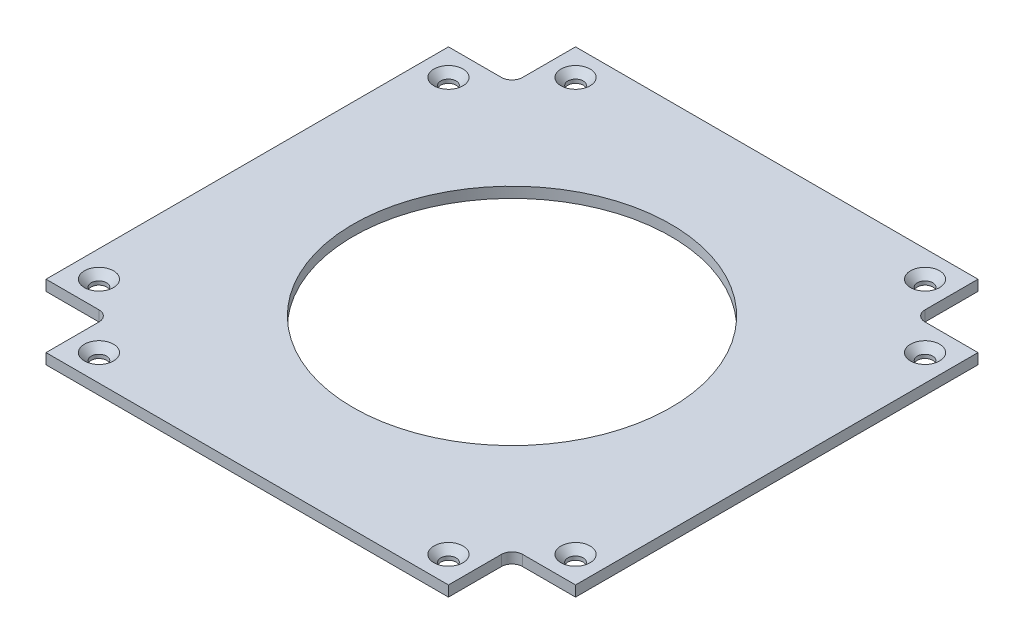
ISO-10303-21;
HEADER;
FILE_DESCRIPTION(('STEP AP214'),'2;1');
FILE_NAME('part.step','',(''),(''),'','','');
FILE_SCHEMA(('AUTOMOTIVE_DESIGN { 1 0 10303 214 1 1 1 1 }'));
ENDSEC;
DATA;
#1=APPLICATION_CONTEXT('core data for automotive mechanical design processes');
#2=APPLICATION_PROTOCOL_DEFINITION('international standard','automotive_design',2000,#1);
#3=PRODUCT_CONTEXT('',#1,'mechanical');
#4=PRODUCT('Part','Part','',(#3));
#5=PRODUCT_RELATED_PRODUCT_CATEGORY('part','',(#4));
#6=PRODUCT_DEFINITION_FORMATION('','',#4);
#7=PRODUCT_DEFINITION_CONTEXT('part definition',#1,'design');
#8=PRODUCT_DEFINITION('design','',#6,#7);
#9=PRODUCT_DEFINITION_SHAPE('','',#8);
#10=(LENGTH_UNIT() NAMED_UNIT(*) SI_UNIT(.MILLI.,.METRE.));
#11=(NAMED_UNIT(*) PLANE_ANGLE_UNIT() SI_UNIT($,.RADIAN.));
#12=(NAMED_UNIT(*) SI_UNIT($,.STERADIAN.) SOLID_ANGLE_UNIT());
#13=UNCERTAINTY_MEASURE_WITH_UNIT(LENGTH_MEASURE(1.E-05),#10,'distance_accuracy_value','');
#14=(GEOMETRIC_REPRESENTATION_CONTEXT(3) GLOBAL_UNCERTAINTY_ASSIGNED_CONTEXT((#13)) GLOBAL_UNIT_ASSIGNED_CONTEXT((#10,
#11,#12)) REPRESENTATION_CONTEXT('',''));
#15=CARTESIAN_POINT('',(0.,0.,0.));
#16=DIRECTION('',(0.,0.,1.));
#17=DIRECTION('',(1.,0.,0.));
#18=AXIS2_PLACEMENT_3D('',#15,#16,#17);
#19=CARTESIAN_POINT('',(0.,1.,0.));
#20=DIRECTION('',(0.,-1.,0.));
#21=DIRECTION('',(0.,0.,-1.));
#22=AXIS2_PLACEMENT_3D('',#19,#20,#21);
#23=PLANE('',#22);
#24=CARTESIAN_POINT('',(-33.,1.,-45.));
#25=DIRECTION('',(0.,1.,0.));
#26=DIRECTION('',(0.,0.,1.));
#27=AXIS2_PLACEMENT_3D('',#24,#25,#26);
#28=CIRCLE('',#27,2.75);
#29=CARTESIAN_POINT('',(-33.,1.,-42.25));
#30=VERTEX_POINT('',#29);
#31=EDGE_CURVE('E676',#30,#30,#28,.T.);
#32=ORIENTED_EDGE('',*,*,#31,.F.);
#33=EDGE_LOOP('',(#32));
#34=FACE_BOUND('',#33,.T.);
#35=CARTESIAN_POINT('',(-45.,1.,-33.));
#36=DIRECTION('',(0.,1.,0.));
#37=DIRECTION('',(0.,0.,1.));
#38=AXIS2_PLACEMENT_3D('',#35,#36,#37);
#39=CIRCLE('',#38,2.75);
#40=CARTESIAN_POINT('',(-45.,1.,-30.25));
#41=VERTEX_POINT('',#40);
#42=EDGE_CURVE('E686',#41,#41,#39,.T.);
#43=ORIENTED_EDGE('',*,*,#42,.F.);
#44=EDGE_LOOP('',(#43));
#45=FACE_BOUND('',#44,.T.);
#46=CARTESIAN_POINT('',(-33.,1.,45.));
#47=DIRECTION('',(0.,1.,0.));
#48=DIRECTION('',(0.,0.,1.));
#49=AXIS2_PLACEMENT_3D('',#46,#47,#48);
#50=CIRCLE('',#49,2.75);
#51=CARTESIAN_POINT('',(-33.,1.,47.75));
#52=VERTEX_POINT('',#51);
#53=EDGE_CURVE('E710',#52,#52,#50,.T.);
#54=ORIENTED_EDGE('',*,*,#53,.F.);
#55=EDGE_LOOP('',(#54));
#56=FACE_BOUND('',#55,.T.);
#57=CARTESIAN_POINT('',(33.,1.,45.));
#58=DIRECTION('',(0.,1.,0.));
#59=DIRECTION('',(0.,0.,1.));
#60=AXIS2_PLACEMENT_3D('',#57,#58,#59);
#61=CIRCLE('',#60,2.75);
#62=CARTESIAN_POINT('',(33.,1.,47.75));
#63=VERTEX_POINT('',#62);
#64=EDGE_CURVE('E722',#63,#63,#61,.T.);
#65=ORIENTED_EDGE('',*,*,#64,.F.);
#66=EDGE_LOOP('',(#65));
#67=FACE_BOUND('',#66,.T.);
#68=CARTESIAN_POINT('',(45.,1.,33.));
#69=DIRECTION('',(0.,1.,0.));
#70=DIRECTION('',(0.,0.,1.));
#71=AXIS2_PLACEMENT_3D('',#68,#69,#70);
#72=CIRCLE('',#71,2.75);
#73=CARTESIAN_POINT('',(45.,1.,35.75));
#74=VERTEX_POINT('',#73);
#75=EDGE_CURVE('E734',#74,#74,#72,.T.);
#76=ORIENTED_EDGE('',*,*,#75,.F.);
#77=EDGE_LOOP('',(#76));
#78=FACE_BOUND('',#77,.T.);
#79=CARTESIAN_POINT('',(45.,1.,-33.));
#80=DIRECTION('',(0.,1.,0.));
#81=DIRECTION('',(0.,0.,1.));
#82=AXIS2_PLACEMENT_3D('',#79,#80,#81);
#83=CIRCLE('',#82,2.75);
#84=CARTESIAN_POINT('',(45.,1.,-30.25));
#85=VERTEX_POINT('',#84);
#86=EDGE_CURVE('E746',#85,#85,#83,.T.);
#87=ORIENTED_EDGE('',*,*,#86,.F.);
#88=EDGE_LOOP('',(#87));
#89=FACE_BOUND('',#88,.T.);
#90=CARTESIAN_POINT('',(33.,1.,-45.));
#91=DIRECTION('',(0.,1.,0.));
#92=DIRECTION('',(0.,0.,1.));
#93=AXIS2_PLACEMENT_3D('',#90,#91,#92);
#94=CIRCLE('',#93,2.75);
#95=CARTESIAN_POINT('',(33.,1.,-42.25));
#96=VERTEX_POINT('',#95);
#97=EDGE_CURVE('E758',#96,#96,#94,.T.);
#98=ORIENTED_EDGE('',*,*,#97,.F.);
#99=EDGE_LOOP('',(#98));
#100=FACE_BOUND('',#99,.T.);
#101=DIRECTION('',(1.,0.,0.));
#102=VECTOR('',#101,1.);
#103=CARTESIAN_POINT('',(-38.,1.,38.));
#104=LINE('',#103,#102);
#105=CARTESIAN_POINT('',(-50.,1.,38.));
#106=VERTEX_POINT('',#105);
#107=CARTESIAN_POINT('',(-40.,1.,38.));
#108=VERTEX_POINT('',#107);
#109=EDGE_CURVE('E169',#106,#108,#104,.T.);
#110=ORIENTED_EDGE('',*,*,#109,.T.);
#111=CARTESIAN_POINT('',(-40.,1.,40.));
#112=DIRECTION('',(0.,-1.,0.));
#113=DIRECTION('',(0.,0.,-1.));
#114=AXIS2_PLACEMENT_3D('',#111,#112,#113);
#115=CIRCLE('',#114,2.);
#116=CARTESIAN_POINT('',(-38.,1.,40.));
#117=VERTEX_POINT('',#116);
#118=EDGE_CURVE('E11',#108,#117,#115,.T.);
#119=ORIENTED_EDGE('',*,*,#118,.T.);
#120=DIRECTION('',(0.,0.,1.));
#121=VECTOR('',#120,1.);
#122=CARTESIAN_POINT('',(-38.,1.,50.));
#123=LINE('',#122,#121);
#124=CARTESIAN_POINT('',(-38.,1.,50.));
#125=VERTEX_POINT('',#124);
#126=EDGE_CURVE('E157',#117,#125,#123,.T.);
#127=ORIENTED_EDGE('',*,*,#126,.T.);
#128=DIRECTION('',(1.,0.,0.));
#129=VECTOR('',#128,1.);
#130=CARTESIAN_POINT('',(38.,1.,50.));
#131=LINE('',#130,#129);
#132=CARTESIAN_POINT('',(38.,1.,50.));
#133=VERTEX_POINT('',#132);
#134=EDGE_CURVE('E162',#125,#133,#131,.T.);
#135=ORIENTED_EDGE('',*,*,#134,.T.);
#136=DIRECTION('',(0.,0.,-1.));
#137=VECTOR('',#136,1.);
#138=CARTESIAN_POINT('',(38.,1.,38.));
#139=LINE('',#138,#137);
#140=CARTESIAN_POINT('',(38.,1.,40.));
#141=VERTEX_POINT('',#140);
#142=EDGE_CURVE('E185',#133,#141,#139,.T.);
#143=ORIENTED_EDGE('',*,*,#142,.T.);
#144=CARTESIAN_POINT('',(40.,1.,40.));
#145=DIRECTION('',(0.,-1.,0.));
#146=DIRECTION('',(0.,0.,-1.));
#147=AXIS2_PLACEMENT_3D('',#144,#145,#146);
#148=CIRCLE('',#147,2.);
#149=CARTESIAN_POINT('',(40.,1.,38.));
#150=VERTEX_POINT('',#149);
#151=EDGE_CURVE('E322',#141,#150,#148,.T.);
#152=ORIENTED_EDGE('',*,*,#151,.T.);
#153=DIRECTION('',(1.,0.,0.));
#154=VECTOR('',#153,1.);
#155=CARTESIAN_POINT('',(50.,1.,38.));
#156=LINE('',#155,#154);
#157=CARTESIAN_POINT('',(50.,1.,38.));
#158=VERTEX_POINT('',#157);
#159=EDGE_CURVE('E188',#150,#158,#156,.T.);
#160=ORIENTED_EDGE('',*,*,#159,.T.);
#161=DIRECTION('',(0.,0.,-1.));
#162=VECTOR('',#161,1.);
#163=CARTESIAN_POINT('',(50.,1.,-38.));
#164=LINE('',#163,#162);
#165=CARTESIAN_POINT('',(50.,1.,-38.));
#166=VERTEX_POINT('',#165);
#167=EDGE_CURVE('E194',#158,#166,#164,.T.);
#168=ORIENTED_EDGE('',*,*,#167,.T.);
#169=DIRECTION('',(-1.,0.,0.));
#170=VECTOR('',#169,1.);
#171=CARTESIAN_POINT('',(38.,1.,-38.));
#172=LINE('',#171,#170);
#173=CARTESIAN_POINT('',(40.,1.,-38.));
#174=VERTEX_POINT('',#173);
#175=EDGE_CURVE('E197',#166,#174,#172,.T.);
#176=ORIENTED_EDGE('',*,*,#175,.T.);
#177=CARTESIAN_POINT('',(40.,1.,-40.));
#178=DIRECTION('',(0.,-1.,0.));
#179=DIRECTION('',(0.,0.,-1.));
#180=AXIS2_PLACEMENT_3D('',#177,#178,#179);
#181=CIRCLE('',#180,2.);
#182=CARTESIAN_POINT('',(38.,1.,-40.));
#183=VERTEX_POINT('',#182);
#184=EDGE_CURVE('E316',#174,#183,#181,.T.);
#185=ORIENTED_EDGE('',*,*,#184,.T.);
#186=DIRECTION('',(0.,0.,-1.));
#187=VECTOR('',#186,1.);
#188=CARTESIAN_POINT('',(38.,1.,-50.));
#189=LINE('',#188,#187);
#190=CARTESIAN_POINT('',(38.,1.,-50.));
#191=VERTEX_POINT('',#190);
#192=EDGE_CURVE('E201',#183,#191,#189,.T.);
#193=ORIENTED_EDGE('',*,*,#192,.T.);
#194=DIRECTION('',(-1.,0.,0.));
#195=VECTOR('',#194,1.);
#196=CARTESIAN_POINT('',(-38.,1.,-50.));
#197=LINE('',#196,#195);
#198=CARTESIAN_POINT('',(-38.,1.,-50.));
#199=VERTEX_POINT('',#198);
#200=EDGE_CURVE('E204',#191,#199,#197,.T.);
#201=ORIENTED_EDGE('',*,*,#200,.T.);
#202=DIRECTION('',(0.,0.,1.));
#203=VECTOR('',#202,1.);
#204=CARTESIAN_POINT('',(-38.,1.,-38.));
#205=LINE('',#204,#203);
#206=CARTESIAN_POINT('',(-38.,1.,-40.));
#207=VERTEX_POINT('',#206);
#208=EDGE_CURVE('E207',#199,#207,#205,.T.);
#209=ORIENTED_EDGE('',*,*,#208,.T.);
#210=CARTESIAN_POINT('',(-40.,1.,-40.));
#211=DIRECTION('',(0.,-1.,0.));
#212=DIRECTION('',(0.,0.,-1.));
#213=AXIS2_PLACEMENT_3D('',#210,#211,#212);
#214=CIRCLE('',#213,2.);
#215=CARTESIAN_POINT('',(-40.,1.,-38.));
#216=VERTEX_POINT('',#215);
#217=EDGE_CURVE('E310',#207,#216,#214,.T.);
#218=ORIENTED_EDGE('',*,*,#217,.T.);
#219=DIRECTION('',(-1.,0.,0.));
#220=VECTOR('',#219,1.);
#221=CARTESIAN_POINT('',(-50.,1.,-38.));
#222=LINE('',#221,#220);
#223=CARTESIAN_POINT('',(-50.,1.,-38.));
#224=VERTEX_POINT('',#223);
#225=EDGE_CURVE('E211',#216,#224,#222,.T.);
#226=ORIENTED_EDGE('',*,*,#225,.T.);
#227=DIRECTION('',(0.,0.,1.));
#228=VECTOR('',#227,1.);
#229=CARTESIAN_POINT('',(-50.,1.,38.));
#230=LINE('',#229,#228);
#231=EDGE_CURVE('E214',#224,#106,#230,.T.);
#232=ORIENTED_EDGE('',*,*,#231,.T.);
#233=EDGE_LOOP('',(#110,#119,#127,#135,#143,#152,#160,#168,#176,#185,#193,#201,#209,#218,#226,#232));
#234=FACE_BOUND('',#233,.T.);
#235=CARTESIAN_POINT('',(0.,1.,0.));
#236=DIRECTION('',(0.,1.,0.));
#237=DIRECTION('',(0.,0.,1.));
#238=AXIS2_PLACEMENT_3D('',#235,#236,#237);
#239=CIRCLE('',#238,30.);
#240=CARTESIAN_POINT('',(0.,1.,30.));
#241=VERTEX_POINT('',#240);
#242=EDGE_CURVE('E221',#241,#241,#239,.T.);
#243=ORIENTED_EDGE('',*,*,#242,.F.);
#244=EDGE_LOOP('',(#243));
#245=FACE_BOUND('',#244,.T.);
#246=CARTESIAN_POINT('',(-45.,1.,33.));
#247=DIRECTION('',(0.,1.,0.));
#248=DIRECTION('',(0.,0.,1.));
#249=AXIS2_PLACEMENT_3D('',#246,#247,#248);
#250=CIRCLE('',#249,2.75);
#251=CARTESIAN_POINT('',(-45.,1.,35.75));
#252=VERTEX_POINT('',#251);
#253=EDGE_CURVE('E698',#252,#252,#250,.T.);
#254=ORIENTED_EDGE('',*,*,#253,.F.);
#255=EDGE_LOOP('',(#254));
#256=FACE_BOUND('',#255,.T.);
#257=ADVANCED_FACE('F44',(#34,#45,#56,#67,#78,#89,#100,#234,#245,#256),#23,.F.);
#258=CARTESIAN_POINT('',(0.,-1.,0.));
#259=DIRECTION('',(0.,-1.,0.));
#260=DIRECTION('',(0.,0.,-1.));
#261=AXIS2_PLACEMENT_3D('',#258,#259,#260);
#262=PLANE('',#261);
#263=CARTESIAN_POINT('',(-33.,-1.,-45.));
#264=DIRECTION('',(0.,1.,0.));
#265=DIRECTION('',(0.,0.,1.));
#266=AXIS2_PLACEMENT_3D('',#263,#264,#265);
#267=CIRCLE('',#266,1.44999999999999);
#268=CARTESIAN_POINT('',(-33.,-1.,-43.55));
#269=VERTEX_POINT('',#268);
#270=EDGE_CURVE('E680',#269,#269,#267,.T.);
#271=ORIENTED_EDGE('',*,*,#270,.T.);
#272=EDGE_LOOP('',(#271));
#273=FACE_BOUND('',#272,.T.);
#274=CARTESIAN_POINT('',(-45.,-1.,-33.));
#275=DIRECTION('',(0.,1.,0.));
#276=DIRECTION('',(0.,0.,1.));
#277=AXIS2_PLACEMENT_3D('',#274,#275,#276);
#278=CIRCLE('',#277,1.44999999999999);
#279=CARTESIAN_POINT('',(-45.,-1.,-31.55));
#280=VERTEX_POINT('',#279);
#281=EDGE_CURVE('E694',#280,#280,#278,.T.);
#282=ORIENTED_EDGE('',*,*,#281,.T.);
#283=EDGE_LOOP('',(#282));
#284=FACE_BOUND('',#283,.T.);
#285=CARTESIAN_POINT('',(-45.,-1.,33.));
#286=DIRECTION('',(0.,1.,0.));
#287=DIRECTION('',(0.,0.,1.));
#288=AXIS2_PLACEMENT_3D('',#285,#286,#287);
#289=CIRCLE('',#288,1.44999999999999);
#290=CARTESIAN_POINT('',(-45.,-1.,34.45));
#291=VERTEX_POINT('',#290);
#292=EDGE_CURVE('E706',#291,#291,#289,.T.);
#293=ORIENTED_EDGE('',*,*,#292,.T.);
#294=EDGE_LOOP('',(#293));
#295=FACE_BOUND('',#294,.T.);
#296=CARTESIAN_POINT('',(45.,-1.,-33.));
#297=DIRECTION('',(0.,1.,0.));
#298=DIRECTION('',(0.,0.,1.));
#299=AXIS2_PLACEMENT_3D('',#296,#297,#298);
#300=CIRCLE('',#299,1.44999999999999);
#301=CARTESIAN_POINT('',(45.,-1.,-31.55));
#302=VERTEX_POINT('',#301);
#303=EDGE_CURVE('E754',#302,#302,#300,.T.);
#304=ORIENTED_EDGE('',*,*,#303,.T.);
#305=EDGE_LOOP('',(#304));
#306=FACE_BOUND('',#305,.T.);
#307=CARTESIAN_POINT('',(33.,-1.,-45.));
#308=DIRECTION('',(0.,1.,0.));
#309=DIRECTION('',(0.,0.,1.));
#310=AXIS2_PLACEMENT_3D('',#307,#308,#309);
#311=CIRCLE('',#310,1.44999999999999);
#312=CARTESIAN_POINT('',(33.,-1.,-43.55));
#313=VERTEX_POINT('',#312);
#314=EDGE_CURVE('E766',#313,#313,#311,.T.);
#315=ORIENTED_EDGE('',*,*,#314,.T.);
#316=EDGE_LOOP('',(#315));
#317=FACE_BOUND('',#316,.T.);
#318=DIRECTION('',(1.,0.,0.));
#319=VECTOR('',#318,1.);
#320=CARTESIAN_POINT('',(-38.,-1.,38.));
#321=LINE('',#320,#319);
#322=CARTESIAN_POINT('',(-50.,-1.,38.));
#323=VERTEX_POINT('',#322);
#324=CARTESIAN_POINT('',(-40.,-1.,38.));
#325=VERTEX_POINT('',#324);
#326=EDGE_CURVE('E218',#323,#325,#321,.T.);
#327=ORIENTED_EDGE('',*,*,#326,.F.);
#328=DIRECTION('',(0.,0.,1.));
#329=VECTOR('',#328,1.);
#330=CARTESIAN_POINT('',(-50.,-1.,38.));
#331=LINE('',#330,#329);
#332=CARTESIAN_POINT('',(-50.,-1.,-38.));
#333=VERTEX_POINT('',#332);
#334=EDGE_CURVE('E254',#333,#323,#331,.T.);
#335=ORIENTED_EDGE('',*,*,#334,.F.);
#336=DIRECTION('',(-1.,0.,0.));
#337=VECTOR('',#336,1.);
#338=CARTESIAN_POINT('',(-50.,-1.,-38.));
#339=LINE('',#338,#337);
#340=CARTESIAN_POINT('',(-40.,-1.,-38.));
#341=VERTEX_POINT('',#340);
#342=EDGE_CURVE('E251',#341,#333,#339,.T.);
#343=ORIENTED_EDGE('',*,*,#342,.F.);
#344=CARTESIAN_POINT('',(-40.,-1.,-40.));
#345=DIRECTION('',(0.,-1.,0.));
#346=DIRECTION('',(0.,0.,-1.));
#347=AXIS2_PLACEMENT_3D('',#344,#345,#346);
#348=CIRCLE('',#347,2.);
#349=CARTESIAN_POINT('',(-38.,-1.,-40.));
#350=VERTEX_POINT('',#349);
#351=EDGE_CURVE('E307',#341,#350,#348,.F.);
#352=ORIENTED_EDGE('',*,*,#351,.T.);
#353=DIRECTION('',(0.,0.,1.));
#354=VECTOR('',#353,1.);
#355=CARTESIAN_POINT('',(-38.,-1.,-38.));
#356=LINE('',#355,#354);
#357=CARTESIAN_POINT('',(-38.,-1.,-50.));
#358=VERTEX_POINT('',#357);
#359=EDGE_CURVE('E247',#358,#350,#356,.T.);
#360=ORIENTED_EDGE('',*,*,#359,.F.);
#361=DIRECTION('',(-1.,0.,0.));
#362=VECTOR('',#361,1.);
#363=CARTESIAN_POINT('',(-38.,-1.,-50.));
#364=LINE('',#363,#362);
#365=CARTESIAN_POINT('',(38.,-1.,-50.));
#366=VERTEX_POINT('',#365);
#367=EDGE_CURVE('E244',#366,#358,#364,.T.);
#368=ORIENTED_EDGE('',*,*,#367,.F.);
#369=DIRECTION('',(0.,0.,-1.));
#370=VECTOR('',#369,1.);
#371=CARTESIAN_POINT('',(38.,-1.,-50.));
#372=LINE('',#371,#370);
#373=CARTESIAN_POINT('',(38.,-1.,-40.));
#374=VERTEX_POINT('',#373);
#375=EDGE_CURVE('E241',#374,#366,#372,.T.);
#376=ORIENTED_EDGE('',*,*,#375,.F.);
#377=CARTESIAN_POINT('',(40.,-1.,-40.));
#378=DIRECTION('',(0.,-1.,0.));
#379=DIRECTION('',(0.,0.,-1.));
#380=AXIS2_PLACEMENT_3D('',#377,#378,#379);
#381=CIRCLE('',#380,2.);
#382=CARTESIAN_POINT('',(40.,-1.,-38.));
#383=VERTEX_POINT('',#382);
#384=EDGE_CURVE('E313',#374,#383,#381,.F.);
#385=ORIENTED_EDGE('',*,*,#384,.T.);
#386=DIRECTION('',(-1.,0.,0.));
#387=VECTOR('',#386,1.);
#388=CARTESIAN_POINT('',(38.,-1.,-38.));
#389=LINE('',#388,#387);
#390=CARTESIAN_POINT('',(50.,-1.,-38.));
#391=VERTEX_POINT('',#390);
#392=EDGE_CURVE('E237',#391,#383,#389,.T.);
#393=ORIENTED_EDGE('',*,*,#392,.F.);
#394=DIRECTION('',(0.,0.,-1.));
#395=VECTOR('',#394,1.);
#396=CARTESIAN_POINT('',(50.,-1.,-38.));
#397=LINE('',#396,#395);
#398=CARTESIAN_POINT('',(50.,-1.,38.));
#399=VERTEX_POINT('',#398);
#400=EDGE_CURVE('E234',#399,#391,#397,.T.);
#401=ORIENTED_EDGE('',*,*,#400,.F.);
#402=DIRECTION('',(1.,0.,0.));
#403=VECTOR('',#402,1.);
#404=CARTESIAN_POINT('',(50.,-1.,38.));
#405=LINE('',#404,#403);
#406=CARTESIAN_POINT('',(40.,-1.,38.));
#407=VERTEX_POINT('',#406);
#408=EDGE_CURVE('E231',#407,#399,#405,.T.);
#409=ORIENTED_EDGE('',*,*,#408,.F.);
#410=CARTESIAN_POINT('',(40.,-1.,40.));
#411=DIRECTION('',(0.,-1.,0.));
#412=DIRECTION('',(0.,0.,-1.));
#413=AXIS2_PLACEMENT_3D('',#410,#411,#412);
#414=CIRCLE('',#413,2.);
#415=CARTESIAN_POINT('',(38.,-1.,40.));
#416=VERTEX_POINT('',#415);
#417=EDGE_CURVE('E319',#407,#416,#414,.F.);
#418=ORIENTED_EDGE('',*,*,#417,.T.);
#419=DIRECTION('',(0.,0.,-1.));
#420=VECTOR('',#419,1.);
#421=CARTESIAN_POINT('',(38.,-1.,38.));
#422=LINE('',#421,#420);
#423=CARTESIAN_POINT('',(38.,-1.,50.));
#424=VERTEX_POINT('',#423);
#425=EDGE_CURVE('E227',#424,#416,#422,.T.);
#426=ORIENTED_EDGE('',*,*,#425,.F.);
#427=DIRECTION('',(1.,0.,0.));
#428=VECTOR('',#427,1.);
#429=CARTESIAN_POINT('',(38.,-1.,50.));
#430=LINE('',#429,#428);
#431=CARTESIAN_POINT('',(-38.,-1.,50.));
#432=VERTEX_POINT('',#431);
#433=EDGE_CURVE('E224',#432,#424,#430,.T.);
#434=ORIENTED_EDGE('',*,*,#433,.F.);
#435=DIRECTION('',(0.,0.,1.));
#436=VECTOR('',#435,1.);
#437=CARTESIAN_POINT('',(-38.,-1.,50.));
#438=LINE('',#437,#436);
#439=CARTESIAN_POINT('',(-38.,-1.,40.));
#440=VERTEX_POINT('',#439);
#441=EDGE_CURVE('E174',#440,#432,#438,.T.);
#442=ORIENTED_EDGE('',*,*,#441,.F.);
#443=CARTESIAN_POINT('',(-40.,-1.,40.));
#444=DIRECTION('',(0.,-1.,0.));
#445=DIRECTION('',(0.,0.,-1.));
#446=AXIS2_PLACEMENT_3D('',#443,#444,#445);
#447=CIRCLE('',#446,2.);
#448=EDGE_CURVE('E53',#440,#325,#447,.F.);
#449=ORIENTED_EDGE('',*,*,#448,.T.);
#450=EDGE_LOOP('',(#327,#335,#343,#352,#360,#368,#376,#385,#393,#401,#409,#418,#426,#434,#442,#449));
#451=FACE_BOUND('',#450,.T.);
#452=CARTESIAN_POINT('',(0.,-1.,0.));
#453=DIRECTION('',(0.,1.,0.));
#454=DIRECTION('',(0.,0.,1.));
#455=AXIS2_PLACEMENT_3D('',#452,#453,#454);
#456=CIRCLE('',#455,30.);
#457=CARTESIAN_POINT('',(0.,-1.,30.));
#458=VERTEX_POINT('',#457);
#459=EDGE_CURVE('E770',#458,#458,#456,.T.);
#460=ORIENTED_EDGE('',*,*,#459,.T.);
#461=EDGE_LOOP('',(#460));
#462=FACE_BOUND('',#461,.T.);
#463=CARTESIAN_POINT('',(45.,-1.,33.));
#464=DIRECTION('',(0.,1.,0.));
#465=DIRECTION('',(0.,0.,1.));
#466=AXIS2_PLACEMENT_3D('',#463,#464,#465);
#467=CIRCLE('',#466,1.44999999999999);
#468=CARTESIAN_POINT('',(45.,-1.,34.45));
#469=VERTEX_POINT('',#468);
#470=EDGE_CURVE('E742',#469,#469,#467,.T.);
#471=ORIENTED_EDGE('',*,*,#470,.T.);
#472=EDGE_LOOP('',(#471));
#473=FACE_BOUND('',#472,.T.);
#474=CARTESIAN_POINT('',(33.,-1.,45.));
#475=DIRECTION('',(0.,1.,0.));
#476=DIRECTION('',(0.,0.,1.));
#477=AXIS2_PLACEMENT_3D('',#474,#475,#476);
#478=CIRCLE('',#477,1.44999999999999);
#479=CARTESIAN_POINT('',(33.,-1.,46.45));
#480=VERTEX_POINT('',#479);
#481=EDGE_CURVE('E730',#480,#480,#478,.T.);
#482=ORIENTED_EDGE('',*,*,#481,.T.);
#483=EDGE_LOOP('',(#482));
#484=FACE_BOUND('',#483,.T.);
#485=CARTESIAN_POINT('',(-33.,-1.,45.));
#486=DIRECTION('',(0.,1.,0.));
#487=DIRECTION('',(0.,0.,1.));
#488=AXIS2_PLACEMENT_3D('',#485,#486,#487);
#489=CIRCLE('',#488,1.44999999999999);
#490=CARTESIAN_POINT('',(-33.,-1.,46.45));
#491=VERTEX_POINT('',#490);
#492=EDGE_CURVE('E718',#491,#491,#489,.T.);
#493=ORIENTED_EDGE('',*,*,#492,.T.);
#494=EDGE_LOOP('',(#493));
#495=FACE_BOUND('',#494,.T.);
#496=ADVANCED_FACE('F337',(#273,#284,#295,#306,#317,#451,#462,#473,#484,#495),#262,.T.);
#497=CARTESIAN_POINT('',(-38.,1.,38.));
#498=DIRECTION('',(0.,0.,-1.));
#499=DIRECTION('',(-1.,0.,0.));
#500=AXIS2_PLACEMENT_3D('',#497,#498,#499);
#501=PLANE('',#500);
#502=ORIENTED_EDGE('',*,*,#326,.T.);
#503=DIRECTION('',(0.,-1.,0.));
#504=VECTOR('',#503,1.);
#505=CARTESIAN_POINT('',(-40.,1.,38.));
#506=LINE('',#505,#504);
#507=EDGE_CURVE('E60',#325,#108,#506,.F.);
#508=ORIENTED_EDGE('',*,*,#507,.T.);
#509=ORIENTED_EDGE('',*,*,#109,.F.);
#510=DIRECTION('',(0.,-1.,0.));
#511=VECTOR('',#510,1.);
#512=CARTESIAN_POINT('',(-50.,1.,38.));
#513=LINE('',#512,#511);
#514=EDGE_CURVE('E217',#106,#323,#513,.T.);
#515=ORIENTED_EDGE('',*,*,#514,.T.);
#516=EDGE_LOOP('',(#502,#508,#509,#515));
#517=FACE_BOUND('',#516,.T.);
#518=ADVANCED_FACE('F359',(#517),#501,.F.);
#519=CARTESIAN_POINT('',(-38.,1.,50.));
#520=DIRECTION('',(1.,0.,0.));
#521=DIRECTION('',(0.,0.,-1.));
#522=AXIS2_PLACEMENT_3D('',#519,#520,#521);
#523=PLANE('',#522);
#524=ORIENTED_EDGE('',*,*,#126,.F.);
#525=DIRECTION('',(0.,-1.,0.));
#526=VECTOR('',#525,1.);
#527=CARTESIAN_POINT('',(-38.,-1.,40.));
#528=LINE('',#527,#526);
#529=EDGE_CURVE('E302',#117,#440,#528,.T.);
#530=ORIENTED_EDGE('',*,*,#529,.T.);
#531=ORIENTED_EDGE('',*,*,#441,.T.);
#532=DIRECTION('',(0.,-1.,0.));
#533=VECTOR('',#532,1.);
#534=CARTESIAN_POINT('',(-38.,1.,50.));
#535=LINE('',#534,#533);
#536=EDGE_CURVE('E172',#125,#432,#535,.T.);
#537=ORIENTED_EDGE('',*,*,#536,.F.);
#538=EDGE_LOOP('',(#524,#530,#531,#537));
#539=FACE_BOUND('',#538,.T.);
#540=ADVANCED_FACE('F173',(#539),#523,.F.);
#541=CARTESIAN_POINT('',(38.,1.,50.));
#542=DIRECTION('',(0.,0.,-1.));
#543=DIRECTION('',(-1.,0.,0.));
#544=AXIS2_PLACEMENT_3D('',#541,#542,#543);
#545=PLANE('',#544);
#546=ORIENTED_EDGE('',*,*,#433,.T.);
#547=DIRECTION('',(0.,-1.,0.));
#548=VECTOR('',#547,1.);
#549=CARTESIAN_POINT('',(38.,1.,50.));
#550=LINE('',#549,#548);
#551=EDGE_CURVE('E179',#133,#424,#550,.T.);
#552=ORIENTED_EDGE('',*,*,#551,.F.);
#553=ORIENTED_EDGE('',*,*,#134,.F.);
#554=ORIENTED_EDGE('',*,*,#536,.T.);
#555=EDGE_LOOP('',(#546,#552,#553,#554));
#556=FACE_BOUND('',#555,.T.);
#557=ADVANCED_FACE('F181',(#556),#545,.F.);
#558=CARTESIAN_POINT('',(38.,1.,38.));
#559=DIRECTION('',(-1.,0.,0.));
#560=DIRECTION('',(0.,0.,1.));
#561=AXIS2_PLACEMENT_3D('',#558,#559,#560);
#562=PLANE('',#561);
#563=ORIENTED_EDGE('',*,*,#425,.T.);
#564=DIRECTION('',(0.,-1.,0.));
#565=VECTOR('',#564,1.);
#566=CARTESIAN_POINT('',(38.,1.,40.));
#567=LINE('',#566,#565);
#568=EDGE_CURVE('E299',#416,#141,#567,.F.);
#569=ORIENTED_EDGE('',*,*,#568,.T.);
#570=ORIENTED_EDGE('',*,*,#142,.F.);
#571=ORIENTED_EDGE('',*,*,#551,.T.);
#572=EDGE_LOOP('',(#563,#569,#570,#571));
#573=FACE_BOUND('',#572,.T.);
#574=ADVANCED_FACE('F341',(#573),#562,.F.);
#575=CARTESIAN_POINT('',(50.,1.,38.));
#576=DIRECTION('',(0.,0.,-1.));
#577=DIRECTION('',(-1.,0.,0.));
#578=AXIS2_PLACEMENT_3D('',#575,#576,#577);
#579=PLANE('',#578);
#580=ORIENTED_EDGE('',*,*,#159,.F.);
#581=DIRECTION('',(0.,-1.,0.));
#582=VECTOR('',#581,1.);
#583=CARTESIAN_POINT('',(40.,-1.,38.));
#584=LINE('',#583,#582);
#585=EDGE_CURVE('E295',#150,#407,#584,.T.);
#586=ORIENTED_EDGE('',*,*,#585,.T.);
#587=ORIENTED_EDGE('',*,*,#408,.T.);
#588=DIRECTION('',(0.,-1.,0.));
#589=VECTOR('',#588,1.);
#590=CARTESIAN_POINT('',(50.,1.,38.));
#591=LINE('',#590,#589);
#592=EDGE_CURVE('E276',#158,#399,#591,.T.);
#593=ORIENTED_EDGE('',*,*,#592,.F.);
#594=EDGE_LOOP('',(#580,#586,#587,#593));
#595=FACE_BOUND('',#594,.T.);
#596=ADVANCED_FACE('F332',(#595),#579,.F.);
#597=CARTESIAN_POINT('',(50.,1.,-38.));
#598=DIRECTION('',(-1.,0.,0.));
#599=DIRECTION('',(0.,0.,1.));
#600=AXIS2_PLACEMENT_3D('',#597,#598,#599);
#601=PLANE('',#600);
#602=ORIENTED_EDGE('',*,*,#400,.T.);
#603=DIRECTION('',(0.,-1.,0.));
#604=VECTOR('',#603,1.);
#605=CARTESIAN_POINT('',(50.,1.,-38.));
#606=LINE('',#605,#604);
#607=EDGE_CURVE('E272',#166,#391,#606,.T.);
#608=ORIENTED_EDGE('',*,*,#607,.F.);
#609=ORIENTED_EDGE('',*,*,#167,.F.);
#610=ORIENTED_EDGE('',*,*,#592,.T.);
#611=EDGE_LOOP('',(#602,#608,#609,#610));
#612=FACE_BOUND('',#611,.T.);
#613=ADVANCED_FACE('F348',(#612),#601,.F.);
#614=CARTESIAN_POINT('',(38.,1.,-38.));
#615=DIRECTION('',(0.,0.,1.));
#616=DIRECTION('',(1.,0.,0.));
#617=AXIS2_PLACEMENT_3D('',#614,#615,#616);
#618=PLANE('',#617);
#619=ORIENTED_EDGE('',*,*,#392,.T.);
#620=DIRECTION('',(0.,-1.,0.));
#621=VECTOR('',#620,1.);
#622=CARTESIAN_POINT('',(40.,1.,-38.));
#623=LINE('',#622,#621);
#624=EDGE_CURVE('E292',#383,#174,#623,.F.);
#625=ORIENTED_EDGE('',*,*,#624,.T.);
#626=ORIENTED_EDGE('',*,*,#175,.F.);
#627=ORIENTED_EDGE('',*,*,#607,.T.);
#628=EDGE_LOOP('',(#619,#625,#626,#627));
#629=FACE_BOUND('',#628,.T.);
#630=ADVANCED_FACE('F387',(#629),#618,.F.);
#631=CARTESIAN_POINT('',(38.,1.,-50.));
#632=DIRECTION('',(-1.,0.,0.));
#633=DIRECTION('',(0.,0.,1.));
#634=AXIS2_PLACEMENT_3D('',#631,#632,#633);
#635=PLANE('',#634);
#636=ORIENTED_EDGE('',*,*,#192,.F.);
#637=DIRECTION('',(0.,-1.,0.));
#638=VECTOR('',#637,1.);
#639=CARTESIAN_POINT('',(38.,-1.,-40.));
#640=LINE('',#639,#638);
#641=EDGE_CURVE('E288',#183,#374,#640,.T.);
#642=ORIENTED_EDGE('',*,*,#641,.T.);
#643=ORIENTED_EDGE('',*,*,#375,.T.);
#644=DIRECTION('',(0.,-1.,0.));
#645=VECTOR('',#644,1.);
#646=CARTESIAN_POINT('',(38.,1.,-50.));
#647=LINE('',#646,#645);
#648=EDGE_CURVE('E268',#191,#366,#647,.T.);
#649=ORIENTED_EDGE('',*,*,#648,.F.);
#650=EDGE_LOOP('',(#636,#642,#643,#649));
#651=FACE_BOUND('',#650,.T.);
#652=ADVANCED_FACE('F383',(#651),#635,.F.);
#653=CARTESIAN_POINT('',(-38.,1.,-50.));
#654=DIRECTION('',(0.,0.,1.));
#655=DIRECTION('',(1.,0.,0.));
#656=AXIS2_PLACEMENT_3D('',#653,#654,#655);
#657=PLANE('',#656);
#658=ORIENTED_EDGE('',*,*,#367,.T.);
#659=DIRECTION('',(0.,-1.,0.));
#660=VECTOR('',#659,1.);
#661=CARTESIAN_POINT('',(-38.,1.,-50.));
#662=LINE('',#661,#660);
#663=EDGE_CURVE('E264',#199,#358,#662,.T.);
#664=ORIENTED_EDGE('',*,*,#663,.F.);
#665=ORIENTED_EDGE('',*,*,#200,.F.);
#666=ORIENTED_EDGE('',*,*,#648,.T.);
#667=EDGE_LOOP('',(#658,#664,#665,#666));
#668=FACE_BOUND('',#667,.T.);
#669=ADVANCED_FACE('F379',(#668),#657,.F.);
#670=CARTESIAN_POINT('',(-38.,1.,-38.));
#671=DIRECTION('',(1.,0.,0.));
#672=DIRECTION('',(0.,0.,-1.));
#673=AXIS2_PLACEMENT_3D('',#670,#671,#672);
#674=PLANE('',#673);
#675=ORIENTED_EDGE('',*,*,#359,.T.);
#676=DIRECTION('',(0.,-1.,0.));
#677=VECTOR('',#676,1.);
#678=CARTESIAN_POINT('',(-38.,1.,-40.));
#679=LINE('',#678,#677);
#680=EDGE_CURVE('E285',#350,#207,#679,.F.);
#681=ORIENTED_EDGE('',*,*,#680,.T.);
#682=ORIENTED_EDGE('',*,*,#208,.F.);
#683=ORIENTED_EDGE('',*,*,#663,.T.);
#684=EDGE_LOOP('',(#675,#681,#682,#683));
#685=FACE_BOUND('',#684,.T.);
#686=ADVANCED_FACE('F375',(#685),#674,.F.);
#687=CARTESIAN_POINT('',(-50.,1.,-38.));
#688=DIRECTION('',(0.,0.,1.));
#689=DIRECTION('',(1.,0.,0.));
#690=AXIS2_PLACEMENT_3D('',#687,#688,#689);
#691=PLANE('',#690);
#692=ORIENTED_EDGE('',*,*,#225,.F.);
#693=DIRECTION('',(0.,-1.,0.));
#694=VECTOR('',#693,1.);
#695=CARTESIAN_POINT('',(-40.,-1.,-38.));
#696=LINE('',#695,#694);
#697=EDGE_CURVE('E178',#216,#341,#696,.T.);
#698=ORIENTED_EDGE('',*,*,#697,.T.);
#699=ORIENTED_EDGE('',*,*,#342,.T.);
#700=DIRECTION('',(0.,-1.,0.));
#701=VECTOR('',#700,1.);
#702=CARTESIAN_POINT('',(-50.,1.,-38.));
#703=LINE('',#702,#701);
#704=EDGE_CURVE('E260',#224,#333,#703,.T.);
#705=ORIENTED_EDGE('',*,*,#704,.F.);
#706=EDGE_LOOP('',(#692,#698,#699,#705));
#707=FACE_BOUND('',#706,.T.);
#708=ADVANCED_FACE('F371',(#707),#691,.F.);
#709=CARTESIAN_POINT('',(-50.,1.,38.));
#710=DIRECTION('',(1.,0.,0.));
#711=DIRECTION('',(0.,0.,-1.));
#712=AXIS2_PLACEMENT_3D('',#709,#710,#711);
#713=PLANE('',#712);
#714=ORIENTED_EDGE('',*,*,#334,.T.);
#715=ORIENTED_EDGE('',*,*,#514,.F.);
#716=ORIENTED_EDGE('',*,*,#231,.F.);
#717=ORIENTED_EDGE('',*,*,#704,.T.);
#718=EDGE_LOOP('',(#714,#715,#716,#717));
#719=FACE_BOUND('',#718,.T.);
#720=ADVANCED_FACE('F368',(#719),#713,.F.);
#721=CARTESIAN_POINT('',(0.,1.,0.));
#722=DIRECTION('',(0.,-1.,0.));
#723=DIRECTION('',(0.,0.,-1.));
#724=AXIS2_PLACEMENT_3D('',#721,#722,#723);
#725=CYLINDRICAL_SURFACE('',#724,30.);
#726=ORIENTED_EDGE('',*,*,#242,.T.);
#727=EDGE_LOOP('',(#726));
#728=FACE_BOUND('',#727,.T.);
#729=ORIENTED_EDGE('',*,*,#459,.F.);
#730=EDGE_LOOP('',(#729));
#731=FACE_BOUND('',#730,.T.);
#732=ADVANCED_FACE('F365',(#728,#731),#725,.F.);
#733=CARTESIAN_POINT('',(-40.,1.,-40.));
#734=DIRECTION('',(0.,1.,0.));
#735=DIRECTION('',(0.,0.,1.));
#736=AXIS2_PLACEMENT_3D('',#733,#734,#735);
#737=CYLINDRICAL_SURFACE('',#736,2.);
#738=ORIENTED_EDGE('',*,*,#217,.F.);
#739=ORIENTED_EDGE('',*,*,#680,.F.);
#740=ORIENTED_EDGE('',*,*,#351,.F.);
#741=ORIENTED_EDGE('',*,*,#697,.F.);
#742=EDGE_LOOP('',(#738,#739,#740,#741));
#743=FACE_BOUND('',#742,.T.);
#744=ADVANCED_FACE('F415',(#743),#737,.F.);
#745=CARTESIAN_POINT('',(40.,1.,-40.));
#746=DIRECTION('',(0.,1.,0.));
#747=DIRECTION('',(0.,0.,1.));
#748=AXIS2_PLACEMENT_3D('',#745,#746,#747);
#749=CYLINDRICAL_SURFACE('',#748,2.);
#750=ORIENTED_EDGE('',*,*,#184,.F.);
#751=ORIENTED_EDGE('',*,*,#624,.F.);
#752=ORIENTED_EDGE('',*,*,#384,.F.);
#753=ORIENTED_EDGE('',*,*,#641,.F.);
#754=EDGE_LOOP('',(#750,#751,#752,#753));
#755=FACE_BOUND('',#754,.T.);
#756=ADVANCED_FACE('F405',(#755),#749,.F.);
#757=CARTESIAN_POINT('',(40.,1.,40.));
#758=DIRECTION('',(0.,1.,0.));
#759=DIRECTION('',(0.,0.,1.));
#760=AXIS2_PLACEMENT_3D('',#757,#758,#759);
#761=CYLINDRICAL_SURFACE('',#760,2.);
#762=ORIENTED_EDGE('',*,*,#151,.F.);
#763=ORIENTED_EDGE('',*,*,#568,.F.);
#764=ORIENTED_EDGE('',*,*,#417,.F.);
#765=ORIENTED_EDGE('',*,*,#585,.F.);
#766=EDGE_LOOP('',(#762,#763,#764,#765));
#767=FACE_BOUND('',#766,.T.);
#768=ADVANCED_FACE('F335',(#767),#761,.F.);
#769=CARTESIAN_POINT('',(-40.,1.,40.));
#770=DIRECTION('',(0.,1.,0.));
#771=DIRECTION('',(0.,0.,1.));
#772=AXIS2_PLACEMENT_3D('',#769,#770,#771);
#773=CYLINDRICAL_SURFACE('',#772,2.);
#774=ORIENTED_EDGE('',*,*,#118,.F.);
#775=ORIENTED_EDGE('',*,*,#507,.F.);
#776=ORIENTED_EDGE('',*,*,#448,.F.);
#777=ORIENTED_EDGE('',*,*,#529,.F.);
#778=EDGE_LOOP('',(#774,#775,#776,#777));
#779=FACE_BOUND('',#778,.T.);
#780=ADVANCED_FACE('F46',(#779),#773,.F.);
#781=CARTESIAN_POINT('',(33.,1.,-45.));
#782=DIRECTION('',(0.,1.,0.));
#783=DIRECTION('',(0.,0.,1.));
#784=AXIS2_PLACEMENT_3D('',#781,#782,#783);
#785=CYLINDRICAL_SURFACE('',#784,1.44999999999999);
#786=ORIENTED_EDGE('',*,*,#314,.F.);
#787=EDGE_LOOP('',(#786));
#788=FACE_BOUND('',#787,.T.);
#789=CARTESIAN_POINT('',(33.,-0.300000000000003,-45.));
#790=DIRECTION('',(0.,1.,0.));
#791=DIRECTION('',(0.,0.,1.));
#792=AXIS2_PLACEMENT_3D('',#789,#790,#791);
#793=CIRCLE('',#792,1.44999999999999);
#794=CARTESIAN_POINT('',(33.,-0.300000000000003,-43.55));
#795=VERTEX_POINT('',#794);
#796=EDGE_CURVE('E762',#795,#795,#793,.T.);
#797=ORIENTED_EDGE('',*,*,#796,.T.);
#798=EDGE_LOOP('',(#797));
#799=FACE_BOUND('',#798,.T.);
#800=ADVANCED_FACE('F425',(#788,#799),#785,.F.);
#801=CARTESIAN_POINT('',(33.,1.,-45.));
#802=DIRECTION('',(0.,1.,0.));
#803=DIRECTION('',(0.,0.,1.));
#804=AXIS2_PLACEMENT_3D('',#801,#802,#803);
#805=CONICAL_SURFACE('',#804,2.75,0.785398163397451);
#806=ORIENTED_EDGE('',*,*,#796,.F.);
#807=EDGE_LOOP('',(#806));
#808=FACE_BOUND('',#807,.T.);
#809=ORIENTED_EDGE('',*,*,#97,.T.);
#810=EDGE_LOOP('',(#809));
#811=FACE_BOUND('',#810,.T.);
#812=ADVANCED_FACE('F430',(#808,#811),#805,.F.);
#813=CARTESIAN_POINT('',(45.,1.,-33.));
#814=DIRECTION('',(0.,1.,0.));
#815=DIRECTION('',(0.,0.,1.));
#816=AXIS2_PLACEMENT_3D('',#813,#814,#815);
#817=CYLINDRICAL_SURFACE('',#816,1.44999999999999);
#818=ORIENTED_EDGE('',*,*,#303,.F.);
#819=EDGE_LOOP('',(#818));
#820=FACE_BOUND('',#819,.T.);
#821=CARTESIAN_POINT('',(45.,-0.300000000000003,-33.));
#822=DIRECTION('',(0.,1.,0.));
#823=DIRECTION('',(0.,0.,1.));
#824=AXIS2_PLACEMENT_3D('',#821,#822,#823);
#825=CIRCLE('',#824,1.44999999999999);
#826=CARTESIAN_POINT('',(45.,-0.300000000000003,-31.55));
#827=VERTEX_POINT('',#826);
#828=EDGE_CURVE('E750',#827,#827,#825,.T.);
#829=ORIENTED_EDGE('',*,*,#828,.T.);
#830=EDGE_LOOP('',(#829));
#831=FACE_BOUND('',#830,.T.);
#832=ADVANCED_FACE('F528',(#820,#831),#817,.F.);
#833=CARTESIAN_POINT('',(45.,1.,-33.));
#834=DIRECTION('',(0.,1.,0.));
#835=DIRECTION('',(0.,0.,1.));
#836=AXIS2_PLACEMENT_3D('',#833,#834,#835);
#837=CONICAL_SURFACE('',#836,2.75,0.785398163397451);
#838=ORIENTED_EDGE('',*,*,#828,.F.);
#839=EDGE_LOOP('',(#838));
#840=FACE_BOUND('',#839,.T.);
#841=ORIENTED_EDGE('',*,*,#86,.T.);
#842=EDGE_LOOP('',(#841));
#843=FACE_BOUND('',#842,.T.);
#844=ADVANCED_FACE('F538',(#840,#843),#837,.F.);
#845=CARTESIAN_POINT('',(45.,1.,33.));
#846=DIRECTION('',(0.,1.,0.));
#847=DIRECTION('',(0.,0.,1.));
#848=AXIS2_PLACEMENT_3D('',#845,#846,#847);
#849=CYLINDRICAL_SURFACE('',#848,1.44999999999999);
#850=ORIENTED_EDGE('',*,*,#470,.F.);
#851=EDGE_LOOP('',(#850));
#852=FACE_BOUND('',#851,.T.);
#853=CARTESIAN_POINT('',(45.,-0.300000000000003,33.));
#854=DIRECTION('',(0.,1.,0.));
#855=DIRECTION('',(0.,0.,1.));
#856=AXIS2_PLACEMENT_3D('',#853,#854,#855);
#857=CIRCLE('',#856,1.44999999999999);
#858=CARTESIAN_POINT('',(45.,-0.300000000000003,34.45));
#859=VERTEX_POINT('',#858);
#860=EDGE_CURVE('E738',#859,#859,#857,.T.);
#861=ORIENTED_EDGE('',*,*,#860,.T.);
#862=EDGE_LOOP('',(#861));
#863=FACE_BOUND('',#862,.T.);
#864=ADVANCED_FACE('F548',(#852,#863),#849,.F.);
#865=CARTESIAN_POINT('',(45.,1.,33.));
#866=DIRECTION('',(0.,1.,0.));
#867=DIRECTION('',(0.,0.,1.));
#868=AXIS2_PLACEMENT_3D('',#865,#866,#867);
#869=CONICAL_SURFACE('',#868,2.75,0.785398163397451);
#870=ORIENTED_EDGE('',*,*,#860,.F.);
#871=EDGE_LOOP('',(#870));
#872=FACE_BOUND('',#871,.T.);
#873=ORIENTED_EDGE('',*,*,#75,.T.);
#874=EDGE_LOOP('',(#873));
#875=FACE_BOUND('',#874,.T.);
#876=ADVANCED_FACE('F558',(#872,#875),#869,.F.);
#877=CARTESIAN_POINT('',(33.,1.,45.));
#878=DIRECTION('',(0.,1.,0.));
#879=DIRECTION('',(0.,0.,1.));
#880=AXIS2_PLACEMENT_3D('',#877,#878,#879);
#881=CYLINDRICAL_SURFACE('',#880,1.44999999999999);
#882=ORIENTED_EDGE('',*,*,#481,.F.);
#883=EDGE_LOOP('',(#882));
#884=FACE_BOUND('',#883,.T.);
#885=CARTESIAN_POINT('',(33.,-0.300000000000003,45.));
#886=DIRECTION('',(0.,1.,0.));
#887=DIRECTION('',(0.,0.,1.));
#888=AXIS2_PLACEMENT_3D('',#885,#886,#887);
#889=CIRCLE('',#888,1.44999999999999);
#890=CARTESIAN_POINT('',(33.,-0.300000000000003,46.45));
#891=VERTEX_POINT('',#890);
#892=EDGE_CURVE('E726',#891,#891,#889,.T.);
#893=ORIENTED_EDGE('',*,*,#892,.T.);
#894=EDGE_LOOP('',(#893));
#895=FACE_BOUND('',#894,.T.);
#896=ADVANCED_FACE('F568',(#884,#895),#881,.F.);
#897=CARTESIAN_POINT('',(33.,1.,45.));
#898=DIRECTION('',(0.,1.,0.));
#899=DIRECTION('',(0.,0.,1.));
#900=AXIS2_PLACEMENT_3D('',#897,#898,#899);
#901=CONICAL_SURFACE('',#900,2.75,0.785398163397451);
#902=ORIENTED_EDGE('',*,*,#892,.F.);
#903=EDGE_LOOP('',(#902));
#904=FACE_BOUND('',#903,.T.);
#905=ORIENTED_EDGE('',*,*,#64,.T.);
#906=EDGE_LOOP('',(#905));
#907=FACE_BOUND('',#906,.T.);
#908=ADVANCED_FACE('F578',(#904,#907),#901,.F.);
#909=CARTESIAN_POINT('',(-33.,1.,45.));
#910=DIRECTION('',(0.,1.,0.));
#911=DIRECTION('',(0.,0.,1.));
#912=AXIS2_PLACEMENT_3D('',#909,#910,#911);
#913=CYLINDRICAL_SURFACE('',#912,1.44999999999999);
#914=ORIENTED_EDGE('',*,*,#492,.F.);
#915=EDGE_LOOP('',(#914));
#916=FACE_BOUND('',#915,.T.);
#917=CARTESIAN_POINT('',(-33.,-0.300000000000003,45.));
#918=DIRECTION('',(0.,1.,0.));
#919=DIRECTION('',(0.,0.,1.));
#920=AXIS2_PLACEMENT_3D('',#917,#918,#919);
#921=CIRCLE('',#920,1.44999999999999);
#922=CARTESIAN_POINT('',(-33.,-0.300000000000003,46.45));
#923=VERTEX_POINT('',#922);
#924=EDGE_CURVE('E714',#923,#923,#921,.T.);
#925=ORIENTED_EDGE('',*,*,#924,.T.);
#926=EDGE_LOOP('',(#925));
#927=FACE_BOUND('',#926,.T.);
#928=ADVANCED_FACE('F588',(#916,#927),#913,.F.);
#929=CARTESIAN_POINT('',(-33.,1.,45.));
#930=DIRECTION('',(0.,1.,0.));
#931=DIRECTION('',(0.,0.,1.));
#932=AXIS2_PLACEMENT_3D('',#929,#930,#931);
#933=CONICAL_SURFACE('',#932,2.75,0.78539816339745);
#934=ORIENTED_EDGE('',*,*,#924,.F.);
#935=EDGE_LOOP('',(#934));
#936=FACE_BOUND('',#935,.T.);
#937=ORIENTED_EDGE('',*,*,#53,.T.);
#938=EDGE_LOOP('',(#937));
#939=FACE_BOUND('',#938,.T.);
#940=ADVANCED_FACE('F598',(#936,#939),#933,.F.);
#941=CARTESIAN_POINT('',(-45.,1.,33.));
#942=DIRECTION('',(0.,1.,0.));
#943=DIRECTION('',(0.,0.,1.));
#944=AXIS2_PLACEMENT_3D('',#941,#942,#943);
#945=CYLINDRICAL_SURFACE('',#944,1.44999999999999);
#946=ORIENTED_EDGE('',*,*,#292,.F.);
#947=EDGE_LOOP('',(#946));
#948=FACE_BOUND('',#947,.T.);
#949=CARTESIAN_POINT('',(-45.,-0.300000000000003,33.));
#950=DIRECTION('',(0.,1.,0.));
#951=DIRECTION('',(0.,0.,1.));
#952=AXIS2_PLACEMENT_3D('',#949,#950,#951);
#953=CIRCLE('',#952,1.44999999999999);
#954=CARTESIAN_POINT('',(-45.,-0.300000000000003,34.45));
#955=VERTEX_POINT('',#954);
#956=EDGE_CURVE('E702',#955,#955,#953,.T.);
#957=ORIENTED_EDGE('',*,*,#956,.T.);
#958=EDGE_LOOP('',(#957));
#959=FACE_BOUND('',#958,.T.);
#960=ADVANCED_FACE('F608',(#948,#959),#945,.F.);
#961=CARTESIAN_POINT('',(-45.,1.,33.));
#962=DIRECTION('',(0.,1.,0.));
#963=DIRECTION('',(0.,0.,1.));
#964=AXIS2_PLACEMENT_3D('',#961,#962,#963);
#965=CONICAL_SURFACE('',#964,2.75,0.785398163397451);
#966=ORIENTED_EDGE('',*,*,#956,.F.);
#967=EDGE_LOOP('',(#966));
#968=FACE_BOUND('',#967,.T.);
#969=ORIENTED_EDGE('',*,*,#253,.T.);
#970=EDGE_LOOP('',(#969));
#971=FACE_BOUND('',#970,.T.);
#972=ADVANCED_FACE('F618',(#968,#971),#965,.F.);
#973=CARTESIAN_POINT('',(-45.,1.,-33.));
#974=DIRECTION('',(0.,1.,0.));
#975=DIRECTION('',(0.,0.,1.));
#976=AXIS2_PLACEMENT_3D('',#973,#974,#975);
#977=CYLINDRICAL_SURFACE('',#976,1.44999999999999);
#978=ORIENTED_EDGE('',*,*,#281,.F.);
#979=EDGE_LOOP('',(#978));
#980=FACE_BOUND('',#979,.T.);
#981=CARTESIAN_POINT('',(-45.,-0.300000000000003,-33.));
#982=DIRECTION('',(0.,1.,0.));
#983=DIRECTION('',(0.,0.,1.));
#984=AXIS2_PLACEMENT_3D('',#981,#982,#983);
#985=CIRCLE('',#984,1.44999999999999);
#986=CARTESIAN_POINT('',(-45.,-0.300000000000003,-31.55));
#987=VERTEX_POINT('',#986);
#988=EDGE_CURVE('E690',#987,#987,#985,.T.);
#989=ORIENTED_EDGE('',*,*,#988,.T.);
#990=EDGE_LOOP('',(#989));
#991=FACE_BOUND('',#990,.T.);
#992=ADVANCED_FACE('F628',(#980,#991),#977,.F.);
#993=CARTESIAN_POINT('',(-45.,1.,-33.));
#994=DIRECTION('',(0.,1.,0.));
#995=DIRECTION('',(0.,0.,1.));
#996=AXIS2_PLACEMENT_3D('',#993,#994,#995);
#997=CONICAL_SURFACE('',#996,2.75,0.785398163397451);
#998=ORIENTED_EDGE('',*,*,#988,.F.);
#999=EDGE_LOOP('',(#998));
#1000=FACE_BOUND('',#999,.T.);
#1001=ORIENTED_EDGE('',*,*,#42,.T.);
#1002=EDGE_LOOP('',(#1001));
#1003=FACE_BOUND('',#1002,.T.);
#1004=ADVANCED_FACE('F638',(#1000,#1003),#997,.F.);
#1005=CARTESIAN_POINT('',(-33.,1.,-45.));
#1006=DIRECTION('',(0.,1.,0.));
#1007=DIRECTION('',(0.,0.,1.));
#1008=AXIS2_PLACEMENT_3D('',#1005,#1006,#1007);
#1009=CYLINDRICAL_SURFACE('',#1008,1.44999999999999);
#1010=ORIENTED_EDGE('',*,*,#270,.F.);
#1011=EDGE_LOOP('',(#1010));
#1012=FACE_BOUND('',#1011,.T.);
#1013=CARTESIAN_POINT('',(-33.,-0.300000000000003,-45.));
#1014=DIRECTION('',(0.,1.,0.));
#1015=DIRECTION('',(0.,0.,1.));
#1016=AXIS2_PLACEMENT_3D('',#1013,#1014,#1015);
#1017=CIRCLE('',#1016,1.44999999999999);
#1018=CARTESIAN_POINT('',(-33.,-0.300000000000003,-43.55));
#1019=VERTEX_POINT('',#1018);
#1020=EDGE_CURVE('E674',#1019,#1019,#1017,.T.);
#1021=ORIENTED_EDGE('',*,*,#1020,.T.);
#1022=EDGE_LOOP('',(#1021));
#1023=FACE_BOUND('',#1022,.T.);
#1024=ADVANCED_FACE('F648',(#1012,#1023),#1009,.F.);
#1025=CARTESIAN_POINT('',(-33.,1.,-45.));
#1026=DIRECTION('',(0.,1.,0.));
#1027=DIRECTION('',(0.,0.,1.));
#1028=AXIS2_PLACEMENT_3D('',#1025,#1026,#1027);
#1029=CONICAL_SURFACE('',#1028,2.75,0.78539816339745);
#1030=ORIENTED_EDGE('',*,*,#1020,.F.);
#1031=EDGE_LOOP('',(#1030));
#1032=FACE_BOUND('',#1031,.T.);
#1033=ORIENTED_EDGE('',*,*,#31,.T.);
#1034=EDGE_LOOP('',(#1033));
#1035=FACE_BOUND('',#1034,.T.);
#1036=ADVANCED_FACE('F658',(#1032,#1035),#1029,.F.);
#1037=CLOSED_SHELL('',(#257,#496,#518,#540,#557,#574,#596,#613,#630,#652,#669,#686,#708,#720,
#732,#744,#756,#768,#780,#800,#812,#832,#844,#864,#876,#896,#908,#928,#940,#960,#972,#992,#1004,
#1024,#1036));
#1038=MANIFOLD_SOLID_BREP('B2',#1037);
#1039=ADVANCED_BREP_SHAPE_REPRESENTATION('',(#18,#1038),#14);
#1040=SHAPE_DEFINITION_REPRESENTATION(#9,#1039);
ENDSEC;
END-ISO-10303-21;
